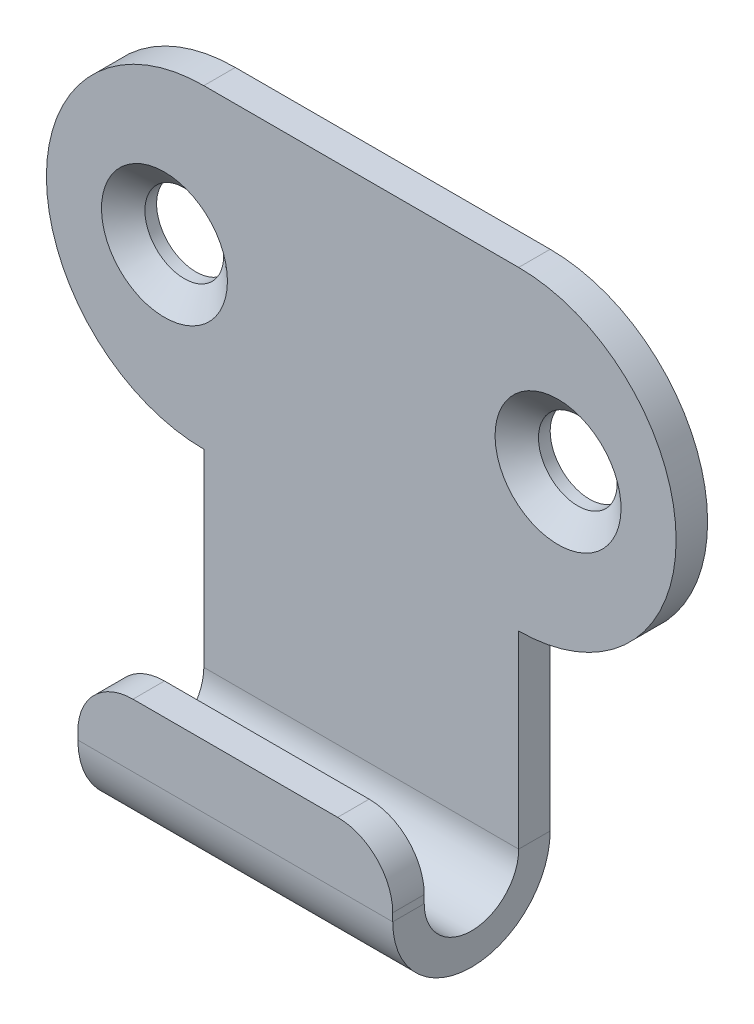
ISO-10303-21;
HEADER;
FILE_DESCRIPTION(('STEP AP214'),'2;1');
FILE_NAME('part.step','',(''),(''),'','','');
FILE_SCHEMA(('AUTOMOTIVE_DESIGN { 1 0 10303 214 1 1 1 1 }'));
ENDSEC;
DATA;
#1=APPLICATION_CONTEXT('core data for automotive mechanical design processes');
#2=APPLICATION_PROTOCOL_DEFINITION('international standard','automotive_design',2000,#1);
#3=PRODUCT_CONTEXT('',#1,'mechanical');
#4=PRODUCT('Part','Part','',(#3));
#5=PRODUCT_RELATED_PRODUCT_CATEGORY('part','',(#4));
#6=PRODUCT_DEFINITION_FORMATION('','',#4);
#7=PRODUCT_DEFINITION_CONTEXT('part definition',#1,'design');
#8=PRODUCT_DEFINITION('design','',#6,#7);
#9=PRODUCT_DEFINITION_SHAPE('','',#8);
#10=(LENGTH_UNIT() NAMED_UNIT(*) SI_UNIT(.MILLI.,.METRE.));
#11=(NAMED_UNIT(*) PLANE_ANGLE_UNIT() SI_UNIT($,.RADIAN.));
#12=(NAMED_UNIT(*) SI_UNIT($,.STERADIAN.) SOLID_ANGLE_UNIT());
#13=UNCERTAINTY_MEASURE_WITH_UNIT(LENGTH_MEASURE(1.E-05),#10,'distance_accuracy_value','');
#14=(GEOMETRIC_REPRESENTATION_CONTEXT(3) GLOBAL_UNCERTAINTY_ASSIGNED_CONTEXT((#13)) GLOBAL_UNIT_ASSIGNED_CONTEXT((#10,
#11,#12)) REPRESENTATION_CONTEXT('',''));
#15=CARTESIAN_POINT('',(0.,0.,0.));
#16=DIRECTION('',(0.,0.,1.));
#17=DIRECTION('',(1.,0.,0.));
#18=AXIS2_PLACEMENT_3D('',#15,#16,#17);
#19=CARTESIAN_POINT('',(10.,-22.,10.));
#20=DIRECTION('',(1.,0.,0.));
#21=DIRECTION('',(0.,0.,-1.));
#22=AXIS2_PLACEMENT_3D('',#19,#20,#21);
#23=PLANE('',#22);
#24=DIRECTION('',(0.,0.,-1.));
#25=VECTOR('',#24,1.);
#26=CARTESIAN_POINT('',(10.,-22.,10.));
#27=LINE('',#26,#25);
#28=CARTESIAN_POINT('',(10.,-22.,10.));
#29=VERTEX_POINT('',#28);
#30=CARTESIAN_POINT('',(10.,-22.,8.));
#31=VERTEX_POINT('',#30);
#32=EDGE_CURVE('E226',#29,#31,#27,.T.);
#33=ORIENTED_EDGE('',*,*,#32,.F.);
#34=CARTESIAN_POINT('',(10.,-22.,5.));
#35=DIRECTION('',(-1.,0.,0.));
#36=DIRECTION('',(0.,0.,1.));
#37=AXIS2_PLACEMENT_3D('',#34,#35,#36);
#38=CIRCLE('',#37,5.);
#39=CARTESIAN_POINT('',(10.,-22.,0.));
#40=VERTEX_POINT('',#39);
#41=EDGE_CURVE('E180',#40,#29,#38,.T.);
#42=ORIENTED_EDGE('',*,*,#41,.F.);
#43=DIRECTION('',(0.,0.,-1.));
#44=VECTOR('',#43,1.);
#45=CARTESIAN_POINT('',(10.,-22.,2.));
#46=LINE('',#45,#44);
#47=CARTESIAN_POINT('',(10.,-22.,2.));
#48=VERTEX_POINT('',#47);
#49=EDGE_CURVE('E223',#48,#40,#46,.T.);
#50=ORIENTED_EDGE('',*,*,#49,.F.);
#51=CARTESIAN_POINT('',(10.,-22.,5.));
#52=DIRECTION('',(1.,0.,0.));
#53=DIRECTION('',(0.,0.,-1.));
#54=AXIS2_PLACEMENT_3D('',#51,#52,#53);
#55=CIRCLE('',#54,3.);
#56=EDGE_CURVE('E188',#48,#31,#55,.F.);
#57=ORIENTED_EDGE('',*,*,#56,.T.);
#58=EDGE_LOOP('',(#33,#42,#50,#57));
#59=FACE_BOUND('',#58,.T.);
#60=ADVANCED_FACE('F37',(#59),#23,.T.);
#61=CARTESIAN_POINT('',(10.,-22.,2.));
#62=DIRECTION('',(1.,0.,0.));
#63=DIRECTION('',(0.,0.,-1.));
#64=AXIS2_PLACEMENT_3D('',#61,#62,#63);
#65=PLANE('',#64);
#66=DIRECTION('',(0.,1.,0.));
#67=VECTOR('',#66,1.);
#68=CARTESIAN_POINT('',(10.,-22.,8.));
#69=LINE('',#68,#67);
#70=CARTESIAN_POINT('',(10.,-21.5,8.));
#71=VERTEX_POINT('',#70);
#72=EDGE_CURVE('E175',#31,#71,#69,.T.);
#73=ORIENTED_EDGE('',*,*,#72,.T.);
#74=DIRECTION('',(0.,0.,-1.));
#75=VECTOR('',#74,1.);
#76=CARTESIAN_POINT('',(10.,-21.5,2.));
#77=LINE('',#76,#75);
#78=CARTESIAN_POINT('',(10.,-21.5,10.));
#79=VERTEX_POINT('',#78);
#80=EDGE_CURVE('E60',#71,#79,#77,.F.);
#81=ORIENTED_EDGE('',*,*,#80,.T.);
#82=DIRECTION('',(0.,1.,0.));
#83=VECTOR('',#82,1.);
#84=CARTESIAN_POINT('',(10.,-22.,10.));
#85=LINE('',#84,#83);
#86=EDGE_CURVE('E177',#29,#79,#85,.T.);
#87=ORIENTED_EDGE('',*,*,#86,.F.);
#88=ORIENTED_EDGE('',*,*,#32,.T.);
#89=EDGE_LOOP('',(#73,#81,#87,#88));
#90=FACE_BOUND('',#89,.T.);
#91=ADVANCED_FACE('F264',(#90),#65,.T.);
#92=CARTESIAN_POINT('',(-10.,-22.,0.));
#93=DIRECTION('',(-1.,0.,0.));
#94=DIRECTION('',(0.,0.,1.));
#95=AXIS2_PLACEMENT_3D('',#92,#93,#94);
#96=PLANE('',#95);
#97=DIRECTION('',(0.,0.,1.));
#98=VECTOR('',#97,1.);
#99=CARTESIAN_POINT('',(-10.,-22.,0.));
#100=LINE('',#99,#98);
#101=CARTESIAN_POINT('',(-10.,-22.,0.));
#102=VERTEX_POINT('',#101);
#103=CARTESIAN_POINT('',(-10.,-22.,2.));
#104=VERTEX_POINT('',#103);
#105=EDGE_CURVE('E220',#102,#104,#100,.T.);
#106=ORIENTED_EDGE('',*,*,#105,.F.);
#107=CARTESIAN_POINT('',(-10.,-22.,5.));
#108=DIRECTION('',(-1.,0.,0.));
#109=DIRECTION('',(0.,0.,1.));
#110=AXIS2_PLACEMENT_3D('',#107,#108,#109);
#111=CIRCLE('',#110,5.);
#112=CARTESIAN_POINT('',(-10.,-22.,10.));
#113=VERTEX_POINT('',#112);
#114=EDGE_CURVE('E196',#102,#113,#111,.T.);
#115=ORIENTED_EDGE('',*,*,#114,.T.);
#116=DIRECTION('',(0.,0.,1.));
#117=VECTOR('',#116,1.);
#118=CARTESIAN_POINT('',(-10.,-22.,8.));
#119=LINE('',#118,#117);
#120=CARTESIAN_POINT('',(-10.,-22.,8.));
#121=VERTEX_POINT('',#120);
#122=EDGE_CURVE('E218',#121,#113,#119,.T.);
#123=ORIENTED_EDGE('',*,*,#122,.F.);
#124=CARTESIAN_POINT('',(-10.,-22.,5.));
#125=DIRECTION('',(1.,0.,0.));
#126=DIRECTION('',(0.,0.,-1.));
#127=AXIS2_PLACEMENT_3D('',#124,#125,#126);
#128=CIRCLE('',#127,3.);
#129=EDGE_CURVE('E178',#104,#121,#128,.F.);
#130=ORIENTED_EDGE('',*,*,#129,.F.);
#131=EDGE_LOOP('',(#106,#115,#123,#130));
#132=FACE_BOUND('',#131,.T.);
#133=ADVANCED_FACE('F289',(#132),#96,.T.);
#134=CARTESIAN_POINT('',(-10.,-22.,8.));
#135=DIRECTION('',(-1.,0.,0.));
#136=DIRECTION('',(0.,0.,1.));
#137=AXIS2_PLACEMENT_3D('',#134,#135,#136);
#138=PLANE('',#137);
#139=DIRECTION('',(0.,0.,1.));
#140=VECTOR('',#139,1.);
#141=CARTESIAN_POINT('',(-10.,-10.,0.));
#142=LINE('',#141,#140);
#143=CARTESIAN_POINT('',(-10.,-10.,0.));
#144=VERTEX_POINT('',#143);
#145=CARTESIAN_POINT('',(-10.,-10.,2.));
#146=VERTEX_POINT('',#145);
#147=EDGE_CURVE('E160',#144,#146,#142,.T.);
#148=ORIENTED_EDGE('',*,*,#147,.F.);
#149=DIRECTION('',(0.,-1.,0.));
#150=VECTOR('',#149,1.);
#151=CARTESIAN_POINT('',(-10.,10.,0.));
#152=LINE('',#151,#150);
#153=EDGE_CURVE('E152',#144,#102,#152,.T.);
#154=ORIENTED_EDGE('',*,*,#153,.T.);
#155=ORIENTED_EDGE('',*,*,#105,.T.);
#156=DIRECTION('',(0.,-1.,0.));
#157=VECTOR('',#156,1.);
#158=CARTESIAN_POINT('',(-10.,10.,2.));
#159=LINE('',#158,#157);
#160=EDGE_CURVE('E151',#146,#104,#159,.T.);
#161=ORIENTED_EDGE('',*,*,#160,.F.);
#162=EDGE_LOOP('',(#148,#154,#155,#161));
#163=FACE_BOUND('',#162,.T.);
#164=ADVANCED_FACE('F355',(#163),#138,.T.);
#165=CARTESIAN_POINT('',(10.,-22.,8.));
#166=DIRECTION('',(0.,0.,1.));
#167=DIRECTION('',(1.,0.,0.));
#168=AXIS2_PLACEMENT_3D('',#165,#166,#167);
#169=PLANE('',#168);
#170=DIRECTION('',(-1.,0.,0.));
#171=VECTOR('',#170,1.);
#172=CARTESIAN_POINT('',(10.,-18.,8.));
#173=LINE('',#172,#171);
#174=CARTESIAN_POINT('',(6.5,-18.,8.));
#175=VERTEX_POINT('',#174);
#176=CARTESIAN_POINT('',(-6.5,-18.,8.));
#177=VERTEX_POINT('',#176);
#178=EDGE_CURVE('E215',#175,#177,#173,.T.);
#179=ORIENTED_EDGE('',*,*,#178,.F.);
#180=CARTESIAN_POINT('',(6.5,-21.5,8.));
#181=DIRECTION('',(0.,0.,1.));
#182=DIRECTION('',(1.,0.,0.));
#183=AXIS2_PLACEMENT_3D('',#180,#181,#182);
#184=CIRCLE('',#183,3.5);
#185=EDGE_CURVE('E247',#175,#71,#184,.F.);
#186=ORIENTED_EDGE('',*,*,#185,.T.);
#187=ORIENTED_EDGE('',*,*,#72,.F.);
#188=DIRECTION('',(-1.,0.,0.));
#189=VECTOR('',#188,1.);
#190=CARTESIAN_POINT('',(10.,-22.,8.));
#191=LINE('',#190,#189);
#192=EDGE_CURVE('E191',#31,#121,#191,.T.);
#193=ORIENTED_EDGE('',*,*,#192,.T.);
#194=DIRECTION('',(0.,1.,0.));
#195=VECTOR('',#194,1.);
#196=CARTESIAN_POINT('',(-10.,-22.,8.));
#197=LINE('',#196,#195);
#198=CARTESIAN_POINT('',(-10.,-21.5,8.));
#199=VERTEX_POINT('',#198);
#200=EDGE_CURVE('E173',#121,#199,#197,.T.);
#201=ORIENTED_EDGE('',*,*,#200,.T.);
#202=CARTESIAN_POINT('',(-6.5,-21.5,8.));
#203=DIRECTION('',(0.,0.,1.));
#204=DIRECTION('',(1.,0.,0.));
#205=AXIS2_PLACEMENT_3D('',#202,#203,#204);
#206=CIRCLE('',#205,3.5);
#207=EDGE_CURVE('E245',#199,#177,#206,.F.);
#208=ORIENTED_EDGE('',*,*,#207,.T.);
#209=EDGE_LOOP('',(#179,#186,#187,#193,#201,#208));
#210=FACE_BOUND('',#209,.T.);
#211=ADVANCED_FACE('F263',(#210),#169,.F.);
#212=CARTESIAN_POINT('',(10.,-18.,10.));
#213=DIRECTION('',(0.,1.,0.));
#214=DIRECTION('',(0.,0.,1.));
#215=AXIS2_PLACEMENT_3D('',#212,#213,#214);
#216=PLANE('',#215);
#217=DIRECTION('',(-1.,0.,0.));
#218=VECTOR('',#217,1.);
#219=CARTESIAN_POINT('',(10.,-18.,10.));
#220=LINE('',#219,#218);
#221=CARTESIAN_POINT('',(6.5,-18.,10.));
#222=VERTEX_POINT('',#221);
#223=CARTESIAN_POINT('',(-6.5,-18.,10.));
#224=VERTEX_POINT('',#223);
#225=EDGE_CURVE('E213',#222,#224,#220,.T.);
#226=ORIENTED_EDGE('',*,*,#225,.F.);
#227=DIRECTION('',(0.,0.,-1.));
#228=VECTOR('',#227,1.);
#229=CARTESIAN_POINT('',(6.5,-18.,10.));
#230=LINE('',#229,#228);
#231=EDGE_CURVE('E242',#222,#175,#230,.T.);
#232=ORIENTED_EDGE('',*,*,#231,.T.);
#233=ORIENTED_EDGE('',*,*,#178,.T.);
#234=DIRECTION('',(0.,0.,-1.));
#235=VECTOR('',#234,1.);
#236=CARTESIAN_POINT('',(-6.5,-18.,10.));
#237=LINE('',#236,#235);
#238=EDGE_CURVE('E240',#177,#224,#237,.F.);
#239=ORIENTED_EDGE('',*,*,#238,.T.);
#240=EDGE_LOOP('',(#226,#232,#233,#239));
#241=FACE_BOUND('',#240,.T.);
#242=ADVANCED_FACE('F257',(#241),#216,.T.);
#243=CARTESIAN_POINT('',(10.,-22.,10.));
#244=DIRECTION('',(0.,0.,1.));
#245=DIRECTION('',(1.,0.,0.));
#246=AXIS2_PLACEMENT_3D('',#243,#244,#245);
#247=PLANE('',#246);
#248=ORIENTED_EDGE('',*,*,#86,.T.);
#249=CARTESIAN_POINT('',(6.5,-21.5,10.));
#250=DIRECTION('',(0.,0.,1.));
#251=DIRECTION('',(1.,0.,0.));
#252=AXIS2_PLACEMENT_3D('',#249,#250,#251);
#253=CIRCLE('',#252,3.5);
#254=EDGE_CURVE('E45',#79,#222,#253,.T.);
#255=ORIENTED_EDGE('',*,*,#254,.T.);
#256=ORIENTED_EDGE('',*,*,#225,.T.);
#257=CARTESIAN_POINT('',(-6.5,-21.5,10.));
#258=DIRECTION('',(0.,0.,1.));
#259=DIRECTION('',(1.,0.,0.));
#260=AXIS2_PLACEMENT_3D('',#257,#258,#259);
#261=CIRCLE('',#260,3.5);
#262=CARTESIAN_POINT('',(-10.,-21.5,10.));
#263=VERTEX_POINT('',#262);
#264=EDGE_CURVE('E52',#224,#263,#261,.T.);
#265=ORIENTED_EDGE('',*,*,#264,.T.);
#266=DIRECTION('',(0.,1.,0.));
#267=VECTOR('',#266,1.);
#268=CARTESIAN_POINT('',(-10.,-22.,10.));
#269=LINE('',#268,#267);
#270=EDGE_CURVE('E194',#113,#263,#269,.T.);
#271=ORIENTED_EDGE('',*,*,#270,.F.);
#272=DIRECTION('',(-1.,0.,0.));
#273=VECTOR('',#272,1.);
#274=CARTESIAN_POINT('',(10.,-22.,10.));
#275=LINE('',#274,#273);
#276=EDGE_CURVE('E210',#29,#113,#275,.T.);
#277=ORIENTED_EDGE('',*,*,#276,.F.);
#278=EDGE_LOOP('',(#248,#255,#256,#265,#271,#277));
#279=FACE_BOUND('',#278,.T.);
#280=ADVANCED_FACE('F252',(#279),#247,.T.);
#281=CARTESIAN_POINT('',(10.,-22.,5.));
#282=DIRECTION('',(-1.,0.,0.));
#283=DIRECTION('',(0.,0.,1.));
#284=AXIS2_PLACEMENT_3D('',#281,#282,#283);
#285=CYLINDRICAL_SURFACE('',#284,5.);
#286=ORIENTED_EDGE('',*,*,#114,.F.);
#287=DIRECTION('',(-1.,0.,0.));
#288=VECTOR('',#287,1.);
#289=CARTESIAN_POINT('',(10.,-22.,0.));
#290=LINE('',#289,#288);
#291=EDGE_CURVE('E141',#40,#102,#290,.T.);
#292=ORIENTED_EDGE('',*,*,#291,.F.);
#293=ORIENTED_EDGE('',*,*,#41,.T.);
#294=ORIENTED_EDGE('',*,*,#276,.T.);
#295=EDGE_LOOP('',(#286,#292,#293,#294));
#296=FACE_BOUND('',#295,.T.);
#297=ADVANCED_FACE('F345',(#296),#285,.T.);
#298=CARTESIAN_POINT('',(10.,10.,0.));
#299=DIRECTION('',(0.,0.,-1.));
#300=DIRECTION('',(0.,1.,0.));
#301=AXIS2_PLACEMENT_3D('',#298,#299,#300);
#302=PLANE('',#301);
#303=CARTESIAN_POINT('',(-12.5,0.,0.));
#304=DIRECTION('',(0.,0.,1.));
#305=DIRECTION('',(1.,0.,0.));
#306=AXIS2_PLACEMENT_3D('',#303,#304,#305);
#307=CIRCLE('',#306,2.5);
#308=CARTESIAN_POINT('',(-10.,0.,0.));
#309=VERTEX_POINT('',#308);
#310=EDGE_CURVE('E168',#309,#309,#307,.T.);
#311=ORIENTED_EDGE('',*,*,#310,.T.);
#312=EDGE_LOOP('',(#311));
#313=FACE_BOUND('',#312,.T.);
#314=CARTESIAN_POINT('',(12.5,0.,0.));
#315=DIRECTION('',(0.,0.,1.));
#316=DIRECTION('',(-1.,0.,0.));
#317=AXIS2_PLACEMENT_3D('',#314,#315,#316);
#318=CIRCLE('',#317,2.5);
#319=CARTESIAN_POINT('',(10.,0.,0.));
#320=VERTEX_POINT('',#319);
#321=EDGE_CURVE('E165',#320,#320,#318,.T.);
#322=ORIENTED_EDGE('',*,*,#321,.T.);
#323=EDGE_LOOP('',(#322));
#324=FACE_BOUND('',#323,.T.);
#325=ORIENTED_EDGE('',*,*,#153,.F.);
#326=CARTESIAN_POINT('',(-10.,0.,0.));
#327=DIRECTION('',(0.,0.,1.));
#328=DIRECTION('',(1.,0.,0.));
#329=AXIS2_PLACEMENT_3D('',#326,#327,#328);
#330=CIRCLE('',#329,10.);
#331=CARTESIAN_POINT('',(-10.,10.,0.));
#332=VERTEX_POINT('',#331);
#333=EDGE_CURVE('E148',#332,#144,#330,.T.);
#334=ORIENTED_EDGE('',*,*,#333,.F.);
#335=DIRECTION('',(-1.,0.,0.));
#336=VECTOR('',#335,1.);
#337=CARTESIAN_POINT('',(10.,10.,0.));
#338=LINE('',#337,#336);
#339=CARTESIAN_POINT('',(10.,10.,0.));
#340=VERTEX_POINT('',#339);
#341=EDGE_CURVE('E130',#340,#332,#338,.T.);
#342=ORIENTED_EDGE('',*,*,#341,.F.);
#343=CARTESIAN_POINT('',(10.,0.,0.));
#344=DIRECTION('',(0.,0.,1.));
#345=DIRECTION('',(1.,0.,0.));
#346=AXIS2_PLACEMENT_3D('',#343,#344,#345);
#347=CIRCLE('',#346,10.);
#348=CARTESIAN_POINT('',(10.,-10.,0.));
#349=VERTEX_POINT('',#348);
#350=EDGE_CURVE('E157',#349,#340,#347,.T.);
#351=ORIENTED_EDGE('',*,*,#350,.F.);
#352=DIRECTION('',(0.,-1.,0.));
#353=VECTOR('',#352,1.);
#354=CARTESIAN_POINT('',(10.,10.,0.));
#355=LINE('',#354,#353);
#356=EDGE_CURVE('E183',#349,#40,#355,.T.);
#357=ORIENTED_EDGE('',*,*,#356,.T.);
#358=ORIENTED_EDGE('',*,*,#291,.T.);
#359=EDGE_LOOP('',(#325,#334,#342,#351,#357,#358));
#360=FACE_BOUND('',#359,.T.);
#361=ADVANCED_FACE('F155',(#313,#324,#360),#302,.T.);
#362=CARTESIAN_POINT('',(10.,10.,2.));
#363=DIRECTION('',(0.,1.,0.));
#364=DIRECTION('',(0.,0.,1.));
#365=AXIS2_PLACEMENT_3D('',#362,#363,#364);
#366=PLANE('',#365);
#367=DIRECTION('',(0.,0.,-1.));
#368=VECTOR('',#367,1.);
#369=CARTESIAN_POINT('',(-10.,10.,2.));
#370=LINE('',#369,#368);
#371=CARTESIAN_POINT('',(-10.,10.,2.));
#372=VERTEX_POINT('',#371);
#373=EDGE_CURVE('E133',#372,#332,#370,.T.);
#374=ORIENTED_EDGE('',*,*,#373,.F.);
#375=DIRECTION('',(-1.,0.,0.));
#376=VECTOR('',#375,1.);
#377=CARTESIAN_POINT('',(10.,10.,2.));
#378=LINE('',#377,#376);
#379=CARTESIAN_POINT('',(10.,10.,2.));
#380=VERTEX_POINT('',#379);
#381=EDGE_CURVE('E142',#380,#372,#378,.T.);
#382=ORIENTED_EDGE('',*,*,#381,.F.);
#383=DIRECTION('',(0.,0.,-1.));
#384=VECTOR('',#383,1.);
#385=CARTESIAN_POINT('',(10.,10.,2.));
#386=LINE('',#385,#384);
#387=EDGE_CURVE('E136',#380,#340,#386,.T.);
#388=ORIENTED_EDGE('',*,*,#387,.T.);
#389=ORIENTED_EDGE('',*,*,#341,.T.);
#390=EDGE_LOOP('',(#374,#382,#388,#389));
#391=FACE_BOUND('',#390,.T.);
#392=ADVANCED_FACE('F132',(#391),#366,.T.);
#393=CARTESIAN_POINT('',(10.,10.,2.));
#394=DIRECTION('',(0.,0.,-1.));
#395=DIRECTION('',(0.,1.,0.));
#396=AXIS2_PLACEMENT_3D('',#393,#394,#395);
#397=PLANE('',#396);
#398=CARTESIAN_POINT('',(12.5,0.,2.));
#399=DIRECTION('',(0.,0.,-1.));
#400=DIRECTION('',(0.,1.,0.));
#401=AXIS2_PLACEMENT_3D('',#398,#399,#400);
#402=CIRCLE('',#401,4.00000000000001);
#403=CARTESIAN_POINT('',(12.5,4.00000000000001,2.));
#404=VERTEX_POINT('',#403);
#405=EDGE_CURVE('E234',#404,#404,#402,.T.);
#406=ORIENTED_EDGE('',*,*,#405,.T.);
#407=EDGE_LOOP('',(#406));
#408=FACE_BOUND('',#407,.T.);
#409=CARTESIAN_POINT('',(-12.5,0.,2.));
#410=DIRECTION('',(0.,0.,-1.));
#411=DIRECTION('',(0.,1.,0.));
#412=AXIS2_PLACEMENT_3D('',#409,#410,#411);
#413=CIRCLE('',#412,4.00000000000001);
#414=CARTESIAN_POINT('',(-12.5,4.00000000000001,2.));
#415=VERTEX_POINT('',#414);
#416=EDGE_CURVE('E231',#415,#415,#413,.T.);
#417=ORIENTED_EDGE('',*,*,#416,.T.);
#418=EDGE_LOOP('',(#417));
#419=FACE_BOUND('',#418,.T.);
#420=DIRECTION('',(0.,-1.,0.));
#421=VECTOR('',#420,1.);
#422=CARTESIAN_POINT('',(10.,10.,2.));
#423=LINE('',#422,#421);
#424=CARTESIAN_POINT('',(10.,-10.,2.));
#425=VERTEX_POINT('',#424);
#426=EDGE_CURVE('E186',#425,#48,#423,.T.);
#427=ORIENTED_EDGE('',*,*,#426,.F.);
#428=CARTESIAN_POINT('',(10.,0.,2.));
#429=DIRECTION('',(0.,0.,1.));
#430=DIRECTION('',(1.,0.,0.));
#431=AXIS2_PLACEMENT_3D('',#428,#429,#430);
#432=CIRCLE('',#431,10.);
#433=EDGE_CURVE('E158',#425,#380,#432,.T.);
#434=ORIENTED_EDGE('',*,*,#433,.T.);
#435=ORIENTED_EDGE('',*,*,#381,.T.);
#436=CARTESIAN_POINT('',(-10.,0.,2.));
#437=DIRECTION('',(0.,0.,1.));
#438=DIRECTION('',(1.,0.,0.));
#439=AXIS2_PLACEMENT_3D('',#436,#437,#438);
#440=CIRCLE('',#439,10.);
#441=EDGE_CURVE('E150',#372,#146,#440,.T.);
#442=ORIENTED_EDGE('',*,*,#441,.T.);
#443=ORIENTED_EDGE('',*,*,#160,.T.);
#444=DIRECTION('',(-1.,0.,0.));
#445=VECTOR('',#444,1.);
#446=CARTESIAN_POINT('',(10.,-22.,2.));
#447=LINE('',#446,#445);
#448=EDGE_CURVE('E205',#48,#104,#447,.T.);
#449=ORIENTED_EDGE('',*,*,#448,.F.);
#450=EDGE_LOOP('',(#427,#434,#435,#442,#443,#449));
#451=FACE_BOUND('',#450,.T.);
#452=ADVANCED_FACE('F337',(#408,#419,#451),#397,.F.);
#453=CARTESIAN_POINT('',(10.,-22.,5.));
#454=DIRECTION('',(-1.,0.,0.));
#455=DIRECTION('',(0.,0.,1.));
#456=AXIS2_PLACEMENT_3D('',#453,#454,#455);
#457=CYLINDRICAL_SURFACE('',#456,3.);
#458=ORIENTED_EDGE('',*,*,#129,.T.);
#459=ORIENTED_EDGE('',*,*,#192,.F.);
#460=ORIENTED_EDGE('',*,*,#56,.F.);
#461=ORIENTED_EDGE('',*,*,#448,.T.);
#462=EDGE_LOOP('',(#458,#459,#460,#461));
#463=FACE_BOUND('',#462,.T.);
#464=ADVANCED_FACE('F272',(#463),#457,.F.);
#465=CARTESIAN_POINT('',(10.,-22.,5.));
#466=DIRECTION('',(-1.,0.,0.));
#467=DIRECTION('',(0.,0.,1.));
#468=AXIS2_PLACEMENT_3D('',#465,#466,#467);
#469=PLANE('',#468);
#470=ORIENTED_EDGE('',*,*,#356,.F.);
#471=DIRECTION('',(0.,0.,1.));
#472=VECTOR('',#471,1.);
#473=CARTESIAN_POINT('',(10.,-10.,0.));
#474=LINE('',#473,#472);
#475=EDGE_CURVE('E170',#349,#425,#474,.T.);
#476=ORIENTED_EDGE('',*,*,#475,.T.);
#477=ORIENTED_EDGE('',*,*,#426,.T.);
#478=ORIENTED_EDGE('',*,*,#49,.T.);
#479=EDGE_LOOP('',(#470,#476,#477,#478));
#480=FACE_BOUND('',#479,.T.);
#481=ADVANCED_FACE('F329',(#480),#469,.F.);
#482=CARTESIAN_POINT('',(-10.,-22.,5.));
#483=DIRECTION('',(-1.,0.,0.));
#484=DIRECTION('',(0.,0.,1.));
#485=AXIS2_PLACEMENT_3D('',#482,#483,#484);
#486=PLANE('',#485);
#487=ORIENTED_EDGE('',*,*,#270,.T.);
#488=DIRECTION('',(0.,0.,-1.));
#489=VECTOR('',#488,1.);
#490=CARTESIAN_POINT('',(-10.,-21.5,5.));
#491=LINE('',#490,#489);
#492=EDGE_CURVE('E11',#263,#199,#491,.T.);
#493=ORIENTED_EDGE('',*,*,#492,.T.);
#494=ORIENTED_EDGE('',*,*,#200,.F.);
#495=ORIENTED_EDGE('',*,*,#122,.T.);
#496=EDGE_LOOP('',(#487,#493,#494,#495));
#497=FACE_BOUND('',#496,.T.);
#498=ADVANCED_FACE('F276',(#497),#486,.T.);
#499=CARTESIAN_POINT('',(10.,0.,0.));
#500=DIRECTION('',(0.,0.,1.));
#501=DIRECTION('',(1.,0.,0.));
#502=AXIS2_PLACEMENT_3D('',#499,#500,#501);
#503=CYLINDRICAL_SURFACE('',#502,10.);
#504=ORIENTED_EDGE('',*,*,#433,.F.);
#505=ORIENTED_EDGE('',*,*,#475,.F.);
#506=ORIENTED_EDGE('',*,*,#350,.T.);
#507=ORIENTED_EDGE('',*,*,#387,.F.);
#508=EDGE_LOOP('',(#504,#505,#506,#507));
#509=FACE_BOUND('',#508,.T.);
#510=ADVANCED_FACE('F323',(#509),#503,.T.);
#511=CARTESIAN_POINT('',(-10.,0.,0.));
#512=DIRECTION('',(0.,0.,1.));
#513=DIRECTION('',(1.,0.,0.));
#514=AXIS2_PLACEMENT_3D('',#511,#512,#513);
#515=CYLINDRICAL_SURFACE('',#514,10.);
#516=ORIENTED_EDGE('',*,*,#441,.F.);
#517=ORIENTED_EDGE('',*,*,#373,.T.);
#518=ORIENTED_EDGE('',*,*,#333,.T.);
#519=ORIENTED_EDGE('',*,*,#147,.T.);
#520=EDGE_LOOP('',(#516,#517,#518,#519));
#521=FACE_BOUND('',#520,.T.);
#522=ADVANCED_FACE('F146',(#521),#515,.T.);
#523=CARTESIAN_POINT('',(12.5,0.,0.));
#524=DIRECTION('',(0.,0.,1.));
#525=DIRECTION('',(1.,0.,0.));
#526=AXIS2_PLACEMENT_3D('',#523,#524,#525);
#527=CYLINDRICAL_SURFACE('',#526,2.5);
#528=CARTESIAN_POINT('',(12.5,0.,0.741350553234071));
#529=DIRECTION('',(0.,0.,-1.));
#530=DIRECTION('',(-1.,0.,0.));
#531=AXIS2_PLACEMENT_3D('',#528,#529,#530);
#532=CIRCLE('',#531,2.5);
#533=CARTESIAN_POINT('',(10.,0.,0.741350553234071));
#534=VERTEX_POINT('',#533);
#535=EDGE_CURVE('E228',#534,#534,#532,.F.);
#536=ORIENTED_EDGE('',*,*,#535,.T.);
#537=EDGE_LOOP('',(#536));
#538=FACE_BOUND('',#537,.T.);
#539=ORIENTED_EDGE('',*,*,#321,.F.);
#540=EDGE_LOOP('',(#539));
#541=FACE_BOUND('',#540,.T.);
#542=ADVANCED_FACE('F308',(#538,#541),#527,.F.);
#543=CARTESIAN_POINT('',(-12.5,0.,0.));
#544=DIRECTION('',(0.,0.,1.));
#545=DIRECTION('',(1.,0.,0.));
#546=AXIS2_PLACEMENT_3D('',#543,#544,#545);
#547=CYLINDRICAL_SURFACE('',#546,2.5);
#548=CARTESIAN_POINT('',(-12.5,0.,0.741350553234071));
#549=DIRECTION('',(0.,0.,-1.));
#550=DIRECTION('',(-1.,0.,0.));
#551=AXIS2_PLACEMENT_3D('',#548,#549,#550);
#552=CIRCLE('',#551,2.5);
#553=CARTESIAN_POINT('',(-15.,0.,0.741350553234071));
#554=VERTEX_POINT('',#553);
#555=EDGE_CURVE('E237',#554,#554,#552,.F.);
#556=ORIENTED_EDGE('',*,*,#555,.T.);
#557=EDGE_LOOP('',(#556));
#558=FACE_BOUND('',#557,.T.);
#559=ORIENTED_EDGE('',*,*,#310,.F.);
#560=EDGE_LOOP('',(#559));
#561=FACE_BOUND('',#560,.T.);
#562=ADVANCED_FACE('F296',(#558,#561),#547,.F.);
#563=CARTESIAN_POINT('',(12.5,0.,0.741350553234071));
#564=DIRECTION('',(0.,0.,1.));
#565=DIRECTION('',(1.,0.,0.));
#566=AXIS2_PLACEMENT_3D('',#563,#564,#565);
#567=CONICAL_SURFACE('',#566,2.5,0.872664625997166);
#568=ORIENTED_EDGE('',*,*,#405,.F.);
#569=EDGE_LOOP('',(#568));
#570=FACE_BOUND('',#569,.T.);
#571=ORIENTED_EDGE('',*,*,#535,.F.);
#572=EDGE_LOOP('',(#571));
#573=FACE_BOUND('',#572,.T.);
#574=ADVANCED_FACE('F293',(#570,#573),#567,.F.);
#575=CARTESIAN_POINT('',(-12.5,0.,0.741350553234071));
#576=DIRECTION('',(0.,0.,1.));
#577=DIRECTION('',(1.,0.,0.));
#578=AXIS2_PLACEMENT_3D('',#575,#576,#577);
#579=CONICAL_SURFACE('',#578,2.5,0.872664625997166);
#580=ORIENTED_EDGE('',*,*,#416,.F.);
#581=EDGE_LOOP('',(#580));
#582=FACE_BOUND('',#581,.T.);
#583=ORIENTED_EDGE('',*,*,#555,.F.);
#584=EDGE_LOOP('',(#583));
#585=FACE_BOUND('',#584,.T.);
#586=ADVANCED_FACE('F283',(#582,#585),#579,.F.);
#587=CARTESIAN_POINT('',(6.5,-21.5,10.));
#588=DIRECTION('',(0.,0.,-1.));
#589=DIRECTION('',(-1.,0.,0.));
#590=AXIS2_PLACEMENT_3D('',#587,#588,#589);
#591=CYLINDRICAL_SURFACE('',#590,3.5);
#592=ORIENTED_EDGE('',*,*,#254,.F.);
#593=ORIENTED_EDGE('',*,*,#80,.F.);
#594=ORIENTED_EDGE('',*,*,#185,.F.);
#595=ORIENTED_EDGE('',*,*,#231,.F.);
#596=EDGE_LOOP('',(#592,#593,#594,#595));
#597=FACE_BOUND('',#596,.T.);
#598=ADVANCED_FACE('F260',(#597),#591,.T.);
#599=CARTESIAN_POINT('',(-6.5,-21.5,5.));
#600=DIRECTION('',(0.,0.,-1.));
#601=DIRECTION('',(-1.,0.,0.));
#602=AXIS2_PLACEMENT_3D('',#599,#600,#601);
#603=CYLINDRICAL_SURFACE('',#602,3.5);
#604=ORIENTED_EDGE('',*,*,#264,.F.);
#605=ORIENTED_EDGE('',*,*,#238,.F.);
#606=ORIENTED_EDGE('',*,*,#207,.F.);
#607=ORIENTED_EDGE('',*,*,#492,.F.);
#608=EDGE_LOOP('',(#604,#605,#606,#607));
#609=FACE_BOUND('',#608,.T.);
#610=ADVANCED_FACE('F39',(#609),#603,.T.);
#611=CLOSED_SHELL('',(#60,#91,#133,#164,#211,#242,#280,#297,#361,#392,#452,#464,#481,#498,#510,
#522,#542,#562,#574,#586,#598,#610));
#612=MANIFOLD_SOLID_BREP('B2',#611);
#613=ADVANCED_BREP_SHAPE_REPRESENTATION('',(#18,#612),#14);
#614=SHAPE_DEFINITION_REPRESENTATION(#9,#613);
ENDSEC;
END-ISO-10303-21;
